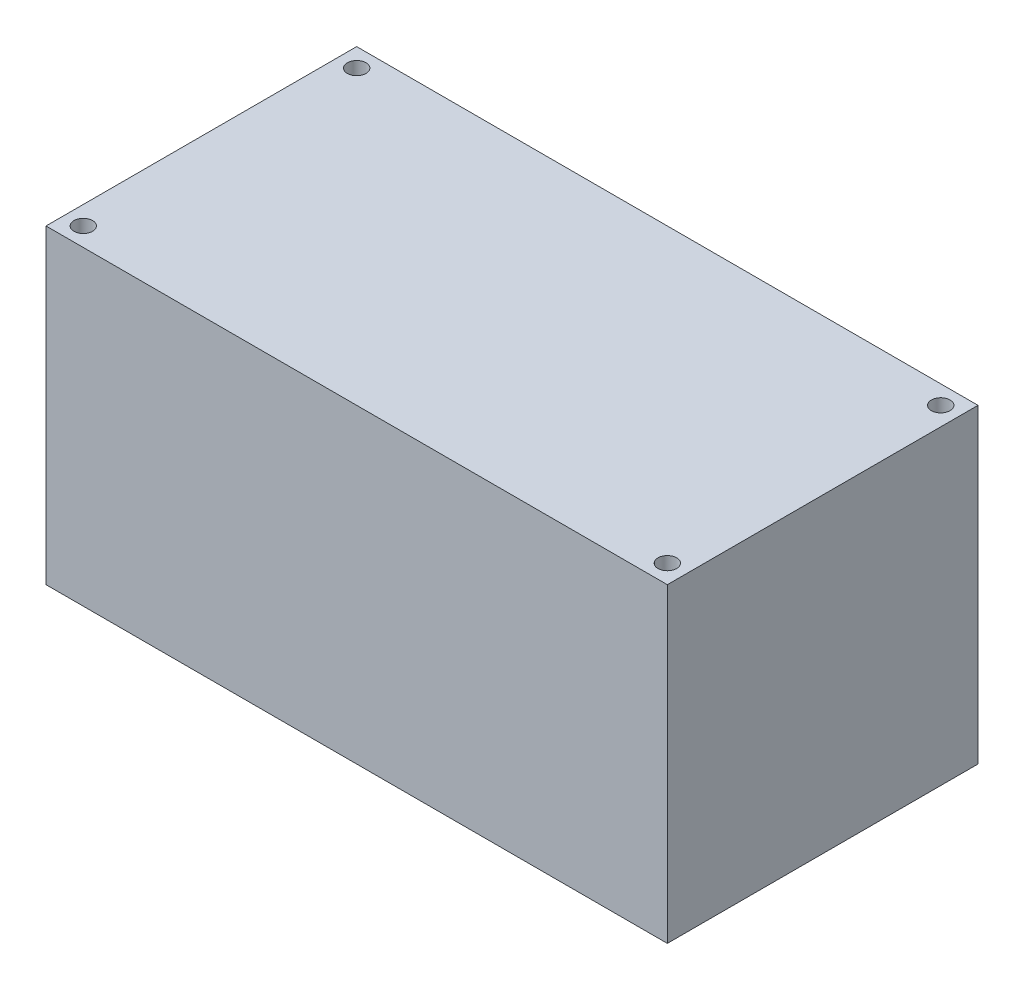
ISO-10303-21;
HEADER;
FILE_DESCRIPTION(('STEP AP214'),'2;1');
FILE_NAME('part.step','',(''),(''),'','','');
FILE_SCHEMA(('AUTOMOTIVE_DESIGN { 1 0 10303 214 1 1 1 1 }'));
ENDSEC;
DATA;
#1=APPLICATION_CONTEXT('core data for automotive mechanical design processes');
#2=APPLICATION_PROTOCOL_DEFINITION('international standard','automotive_design',2000,#1);
#3=PRODUCT_CONTEXT('',#1,'mechanical');
#4=PRODUCT('Part','Part','',(#3));
#5=PRODUCT_RELATED_PRODUCT_CATEGORY('part','',(#4));
#6=PRODUCT_DEFINITION_FORMATION('','',#4);
#7=PRODUCT_DEFINITION_CONTEXT('part definition',#1,'design');
#8=PRODUCT_DEFINITION('design','',#6,#7);
#9=PRODUCT_DEFINITION_SHAPE('','',#8);
#10=(LENGTH_UNIT() NAMED_UNIT(*) SI_UNIT(.MILLI.,.METRE.));
#11=(NAMED_UNIT(*) PLANE_ANGLE_UNIT() SI_UNIT($,.RADIAN.));
#12=(NAMED_UNIT(*) SI_UNIT($,.STERADIAN.) SOLID_ANGLE_UNIT());
#13=UNCERTAINTY_MEASURE_WITH_UNIT(LENGTH_MEASURE(1.E-05),#10,'distance_accuracy_value','');
#14=(GEOMETRIC_REPRESENTATION_CONTEXT(3) GLOBAL_UNCERTAINTY_ASSIGNED_CONTEXT((#13)) GLOBAL_UNIT_ASSIGNED_CONTEXT((#10,
#11,#12)) REPRESENTATION_CONTEXT('',''));
#15=CARTESIAN_POINT('',(0.,0.,0.));
#16=DIRECTION('',(0.,0.,1.));
#17=DIRECTION('',(1.,0.,0.));
#18=AXIS2_PLACEMENT_3D('',#15,#16,#17);
#19=CARTESIAN_POINT('',(-50.,50.,-25.));
#20=DIRECTION('',(1.,0.,0.));
#21=DIRECTION('',(0.,0.,-1.));
#22=AXIS2_PLACEMENT_3D('',#19,#20,#21);
#23=PLANE('',#22);
#24=DIRECTION('',(0.,0.,1.));
#25=VECTOR('',#24,1.);
#26=CARTESIAN_POINT('',(-50.,0.,-25.));
#27=LINE('',#26,#25);
#28=CARTESIAN_POINT('',(-50.,0.,-25.));
#29=VERTEX_POINT('',#28);
#30=CARTESIAN_POINT('',(-50.,0.,25.));
#31=VERTEX_POINT('',#30);
#32=EDGE_CURVE('E98',#29,#31,#27,.T.);
#33=ORIENTED_EDGE('',*,*,#32,.T.);
#34=DIRECTION('',(0.,-1.,0.));
#35=VECTOR('',#34,1.);
#36=CARTESIAN_POINT('',(-50.,50.,25.));
#37=LINE('',#36,#35);
#38=CARTESIAN_POINT('',(-50.,50.,25.));
#39=VERTEX_POINT('',#38);
#40=EDGE_CURVE('E11',#39,#31,#37,.T.);
#41=ORIENTED_EDGE('',*,*,#40,.F.);
#42=DIRECTION('',(0.,0.,1.));
#43=VECTOR('',#42,1.);
#44=CARTESIAN_POINT('',(-50.,50.,-25.));
#45=LINE('',#44,#43);
#46=CARTESIAN_POINT('',(-50.,50.,-25.));
#47=VERTEX_POINT('',#46);
#48=EDGE_CURVE('E86',#47,#39,#45,.T.);
#49=ORIENTED_EDGE('',*,*,#48,.F.);
#50=DIRECTION('',(0.,-1.,0.));
#51=VECTOR('',#50,1.);
#52=CARTESIAN_POINT('',(-50.,50.,-25.));
#53=LINE('',#52,#51);
#54=EDGE_CURVE('E94',#47,#29,#53,.T.);
#55=ORIENTED_EDGE('',*,*,#54,.T.);
#56=EDGE_LOOP('',(#33,#41,#49,#55));
#57=FACE_BOUND('',#56,.T.);
#58=ADVANCED_FACE('F35',(#57),#23,.F.);
#59=CARTESIAN_POINT('',(-50.,50.,25.));
#60=DIRECTION('',(0.,0.,-1.));
#61=DIRECTION('',(-1.,0.,0.));
#62=AXIS2_PLACEMENT_3D('',#59,#60,#61);
#63=PLANE('',#62);
#64=DIRECTION('',(1.,0.,0.));
#65=VECTOR('',#64,1.);
#66=CARTESIAN_POINT('',(-50.,0.,25.));
#67=LINE('',#66,#65);
#68=CARTESIAN_POINT('',(50.,0.,25.));
#69=VERTEX_POINT('',#68);
#70=EDGE_CURVE('E90',#31,#69,#67,.T.);
#71=ORIENTED_EDGE('',*,*,#70,.T.);
#72=DIRECTION('',(0.,-1.,0.));
#73=VECTOR('',#72,1.);
#74=CARTESIAN_POINT('',(50.,50.,25.));
#75=LINE('',#74,#73);
#76=CARTESIAN_POINT('',(50.,50.,25.));
#77=VERTEX_POINT('',#76);
#78=EDGE_CURVE('E43',#77,#69,#75,.T.);
#79=ORIENTED_EDGE('',*,*,#78,.F.);
#80=DIRECTION('',(1.,0.,0.));
#81=VECTOR('',#80,1.);
#82=CARTESIAN_POINT('',(-50.,50.,25.));
#83=LINE('',#82,#81);
#84=EDGE_CURVE('E81',#39,#77,#83,.T.);
#85=ORIENTED_EDGE('',*,*,#84,.F.);
#86=ORIENTED_EDGE('',*,*,#40,.T.);
#87=EDGE_LOOP('',(#71,#79,#85,#86));
#88=FACE_BOUND('',#87,.T.);
#89=ADVANCED_FACE('F89',(#88),#63,.F.);
#90=CARTESIAN_POINT('',(50.,50.,-25.));
#91=DIRECTION('',(-1.,0.,0.));
#92=DIRECTION('',(0.,0.,1.));
#93=AXIS2_PLACEMENT_3D('',#90,#91,#92);
#94=PLANE('',#93);
#95=DIRECTION('',(0.,0.,-1.));
#96=VECTOR('',#95,1.);
#97=CARTESIAN_POINT('',(50.,0.,-25.));
#98=LINE('',#97,#96);
#99=CARTESIAN_POINT('',(50.,0.,-25.));
#100=VERTEX_POINT('',#99);
#101=EDGE_CURVE('E68',#69,#100,#98,.T.);
#102=ORIENTED_EDGE('',*,*,#101,.T.);
#103=DIRECTION('',(0.,-1.,0.));
#104=VECTOR('',#103,1.);
#105=CARTESIAN_POINT('',(50.,50.,-25.));
#106=LINE('',#105,#104);
#107=CARTESIAN_POINT('',(50.,50.,-25.));
#108=VERTEX_POINT('',#107);
#109=EDGE_CURVE('E91',#108,#100,#106,.T.);
#110=ORIENTED_EDGE('',*,*,#109,.F.);
#111=DIRECTION('',(0.,0.,-1.));
#112=VECTOR('',#111,1.);
#113=CARTESIAN_POINT('',(50.,50.,-25.));
#114=LINE('',#113,#112);
#115=EDGE_CURVE('E84',#77,#108,#114,.T.);
#116=ORIENTED_EDGE('',*,*,#115,.F.);
#117=ORIENTED_EDGE('',*,*,#78,.T.);
#118=EDGE_LOOP('',(#102,#110,#116,#117));
#119=FACE_BOUND('',#118,.T.);
#120=ADVANCED_FACE('F92',(#119),#94,.F.);
#121=CARTESIAN_POINT('',(-50.,50.,-25.));
#122=DIRECTION('',(0.,0.,1.));
#123=DIRECTION('',(1.,0.,0.));
#124=AXIS2_PLACEMENT_3D('',#121,#122,#123);
#125=PLANE('',#124);
#126=DIRECTION('',(-1.,0.,0.));
#127=VECTOR('',#126,1.);
#128=CARTESIAN_POINT('',(-50.,0.,-25.));
#129=LINE('',#128,#127);
#130=EDGE_CURVE('E74',#100,#29,#129,.T.);
#131=ORIENTED_EDGE('',*,*,#130,.T.);
#132=ORIENTED_EDGE('',*,*,#54,.F.);
#133=DIRECTION('',(-1.,0.,0.));
#134=VECTOR('',#133,1.);
#135=CARTESIAN_POINT('',(-50.,50.,-25.));
#136=LINE('',#135,#134);
#137=EDGE_CURVE('E51',#108,#47,#136,.T.);
#138=ORIENTED_EDGE('',*,*,#137,.F.);
#139=ORIENTED_EDGE('',*,*,#109,.T.);
#140=EDGE_LOOP('',(#131,#132,#138,#139));
#141=FACE_BOUND('',#140,.T.);
#142=ADVANCED_FACE('F106',(#141),#125,.F.);
#143=CARTESIAN_POINT('',(0.,50.,0.));
#144=DIRECTION('',(0.,1.,0.));
#145=DIRECTION('',(0.,0.,1.));
#146=AXIS2_PLACEMENT_3D('',#143,#144,#145);
#147=PLANE('',#146);
#148=CARTESIAN_POINT('',(47.,50.,-22.));
#149=DIRECTION('',(0.,1.,0.));
#150=DIRECTION('',(0.,0.,-1.));
#151=AXIS2_PLACEMENT_3D('',#148,#149,#150);
#152=CIRCLE('',#151,1.5);
#153=CARTESIAN_POINT('',(47.,50.,-23.5));
#154=VERTEX_POINT('',#153);
#155=EDGE_CURVE('E130',#154,#154,#152,.T.);
#156=ORIENTED_EDGE('',*,*,#155,.F.);
#157=EDGE_LOOP('',(#156));
#158=FACE_BOUND('',#157,.T.);
#159=CARTESIAN_POINT('',(47.,50.,22.));
#160=DIRECTION('',(0.,1.,0.));
#161=DIRECTION('',(0.,0.,-1.));
#162=AXIS2_PLACEMENT_3D('',#159,#160,#161);
#163=CIRCLE('',#162,1.50000000000002);
#164=CARTESIAN_POINT('',(47.,50.,20.5));
#165=VERTEX_POINT('',#164);
#166=EDGE_CURVE('E124',#165,#165,#163,.T.);
#167=ORIENTED_EDGE('',*,*,#166,.F.);
#168=EDGE_LOOP('',(#167));
#169=FACE_BOUND('',#168,.T.);
#170=CARTESIAN_POINT('',(-47.,50.,22.));
#171=DIRECTION('',(0.,1.,0.));
#172=DIRECTION('',(0.,0.,1.));
#173=AXIS2_PLACEMENT_3D('',#170,#171,#172);
#174=CIRCLE('',#173,1.5);
#175=CARTESIAN_POINT('',(-47.,50.,23.5));
#176=VERTEX_POINT('',#175);
#177=EDGE_CURVE('E118',#176,#176,#174,.T.);
#178=ORIENTED_EDGE('',*,*,#177,.F.);
#179=EDGE_LOOP('',(#178));
#180=FACE_BOUND('',#179,.T.);
#181=CARTESIAN_POINT('',(-47.,50.,-22.));
#182=DIRECTION('',(0.,1.,0.));
#183=DIRECTION('',(0.,0.,1.));
#184=AXIS2_PLACEMENT_3D('',#181,#182,#183);
#185=CIRCLE('',#184,1.5);
#186=CARTESIAN_POINT('',(-47.,50.,-20.5));
#187=VERTEX_POINT('',#186);
#188=EDGE_CURVE('E112',#187,#187,#185,.T.);
#189=ORIENTED_EDGE('',*,*,#188,.F.);
#190=EDGE_LOOP('',(#189));
#191=FACE_BOUND('',#190,.T.);
#192=ORIENTED_EDGE('',*,*,#48,.T.);
#193=ORIENTED_EDGE('',*,*,#84,.T.);
#194=ORIENTED_EDGE('',*,*,#115,.T.);
#195=ORIENTED_EDGE('',*,*,#137,.T.);
#196=EDGE_LOOP('',(#192,#193,#194,#195));
#197=FACE_BOUND('',#196,.T.);
#198=ADVANCED_FACE('F82',(#158,#169,#180,#191,#197),#147,.T.);
#199=CARTESIAN_POINT('',(0.,0.,0.));
#200=DIRECTION('',(0.,1.,0.));
#201=DIRECTION('',(0.,0.,1.));
#202=AXIS2_PLACEMENT_3D('',#199,#200,#201);
#203=PLANE('',#202);
#204=ORIENTED_EDGE('',*,*,#32,.F.);
#205=ORIENTED_EDGE('',*,*,#130,.F.);
#206=ORIENTED_EDGE('',*,*,#101,.F.);
#207=ORIENTED_EDGE('',*,*,#70,.F.);
#208=EDGE_LOOP('',(#204,#205,#206,#207));
#209=FACE_BOUND('',#208,.T.);
#210=ADVANCED_FACE('F109',(#209),#203,.F.);
#211=CARTESIAN_POINT('',(-47.,20.,-22.));
#212=DIRECTION('',(0.,1.,0.));
#213=DIRECTION('',(0.,0.,1.));
#214=AXIS2_PLACEMENT_3D('',#211,#212,#213);
#215=CYLINDRICAL_SURFACE('',#214,1.5);
#216=CARTESIAN_POINT('',(-47.,20.,-22.));
#217=DIRECTION('',(0.,1.,0.));
#218=DIRECTION('',(0.,0.,1.));
#219=AXIS2_PLACEMENT_3D('',#216,#217,#218);
#220=CIRCLE('',#219,1.5);
#221=CARTESIAN_POINT('',(-47.,20.,-20.5));
#222=VERTEX_POINT('',#221);
#223=EDGE_CURVE('E101',#222,#222,#220,.T.);
#224=ORIENTED_EDGE('',*,*,#223,.F.);
#225=EDGE_LOOP('',(#224));
#226=FACE_BOUND('',#225,.T.);
#227=ORIENTED_EDGE('',*,*,#188,.T.);
#228=EDGE_LOOP('',(#227));
#229=FACE_BOUND('',#228,.T.);
#230=ADVANCED_FACE('F154',(#226,#229),#215,.F.);
#231=CARTESIAN_POINT('',(-47.,20.,-22.));
#232=DIRECTION('',(0.,1.,0.));
#233=DIRECTION('',(0.,0.,1.));
#234=AXIS2_PLACEMENT_3D('',#231,#232,#233);
#235=PLANE('',#234);
#236=ORIENTED_EDGE('',*,*,#223,.T.);
#237=EDGE_LOOP('',(#236));
#238=FACE_BOUND('',#237,.T.);
#239=ADVANCED_FACE('F156',(#238),#235,.T.);
#240=CARTESIAN_POINT('',(-47.,20.,22.));
#241=DIRECTION('',(0.,1.,0.));
#242=DIRECTION('',(0.,0.,1.));
#243=AXIS2_PLACEMENT_3D('',#240,#241,#242);
#244=CYLINDRICAL_SURFACE('',#243,1.5);
#245=CARTESIAN_POINT('',(-47.,20.,22.));
#246=DIRECTION('',(0.,1.,0.));
#247=DIRECTION('',(0.,0.,1.));
#248=AXIS2_PLACEMENT_3D('',#245,#246,#247);
#249=CIRCLE('',#248,1.5);
#250=CARTESIAN_POINT('',(-47.,20.,23.5));
#251=VERTEX_POINT('',#250);
#252=EDGE_CURVE('E115',#251,#251,#249,.T.);
#253=ORIENTED_EDGE('',*,*,#252,.F.);
#254=EDGE_LOOP('',(#253));
#255=FACE_BOUND('',#254,.T.);
#256=ORIENTED_EDGE('',*,*,#177,.T.);
#257=EDGE_LOOP('',(#256));
#258=FACE_BOUND('',#257,.T.);
#259=ADVANCED_FACE('F163',(#255,#258),#244,.F.);
#260=CARTESIAN_POINT('',(-47.,20.,22.));
#261=DIRECTION('',(0.,1.,0.));
#262=DIRECTION('',(0.,0.,1.));
#263=AXIS2_PLACEMENT_3D('',#260,#261,#262);
#264=PLANE('',#263);
#265=ORIENTED_EDGE('',*,*,#252,.T.);
#266=EDGE_LOOP('',(#265));
#267=FACE_BOUND('',#266,.T.);
#268=ADVANCED_FACE('F211',(#267),#264,.T.);
#269=CARTESIAN_POINT('',(47.,20.,22.));
#270=DIRECTION('',(0.,1.,0.));
#271=DIRECTION('',(0.,0.,1.));
#272=AXIS2_PLACEMENT_3D('',#269,#270,#271);
#273=CYLINDRICAL_SURFACE('',#272,1.50000000000002);
#274=CARTESIAN_POINT('',(47.,20.,22.));
#275=DIRECTION('',(0.,1.,0.));
#276=DIRECTION('',(0.,0.,-1.));
#277=AXIS2_PLACEMENT_3D('',#274,#275,#276);
#278=CIRCLE('',#277,1.50000000000002);
#279=CARTESIAN_POINT('',(47.,20.,20.5));
#280=VERTEX_POINT('',#279);
#281=EDGE_CURVE('E121',#280,#280,#278,.T.);
#282=ORIENTED_EDGE('',*,*,#281,.F.);
#283=EDGE_LOOP('',(#282));
#284=FACE_BOUND('',#283,.T.);
#285=ORIENTED_EDGE('',*,*,#166,.T.);
#286=EDGE_LOOP('',(#285));
#287=FACE_BOUND('',#286,.T.);
#288=ADVANCED_FACE('F220',(#284,#287),#273,.F.);
#289=CARTESIAN_POINT('',(47.,20.,22.));
#290=DIRECTION('',(0.,-1.,0.));
#291=DIRECTION('',(0.,0.,-1.));
#292=AXIS2_PLACEMENT_3D('',#289,#290,#291);
#293=PLANE('',#292);
#294=ORIENTED_EDGE('',*,*,#281,.T.);
#295=EDGE_LOOP('',(#294));
#296=FACE_BOUND('',#295,.T.);
#297=ADVANCED_FACE('F141',(#296),#293,.F.);
#298=CARTESIAN_POINT('',(47.,20.,-22.));
#299=DIRECTION('',(0.,1.,0.));
#300=DIRECTION('',(0.,0.,1.));
#301=AXIS2_PLACEMENT_3D('',#298,#299,#300);
#302=CYLINDRICAL_SURFACE('',#301,1.5);
#303=CARTESIAN_POINT('',(47.,20.,-22.));
#304=DIRECTION('',(0.,1.,0.));
#305=DIRECTION('',(0.,0.,-1.));
#306=AXIS2_PLACEMENT_3D('',#303,#304,#305);
#307=CIRCLE('',#306,1.5);
#308=CARTESIAN_POINT('',(47.,20.,-23.5));
#309=VERTEX_POINT('',#308);
#310=EDGE_CURVE('E127',#309,#309,#307,.T.);
#311=ORIENTED_EDGE('',*,*,#310,.F.);
#312=EDGE_LOOP('',(#311));
#313=FACE_BOUND('',#312,.T.);
#314=ORIENTED_EDGE('',*,*,#155,.T.);
#315=EDGE_LOOP('',(#314));
#316=FACE_BOUND('',#315,.T.);
#317=ADVANCED_FACE('F138',(#313,#316),#302,.F.);
#318=CARTESIAN_POINT('',(47.,20.,-22.));
#319=DIRECTION('',(0.,-1.,0.));
#320=DIRECTION('',(0.,0.,-1.));
#321=AXIS2_PLACEMENT_3D('',#318,#319,#320);
#322=PLANE('',#321);
#323=ORIENTED_EDGE('',*,*,#310,.T.);
#324=EDGE_LOOP('',(#323));
#325=FACE_BOUND('',#324,.T.);
#326=ADVANCED_FACE('F136',(#325),#322,.F.);
#327=CLOSED_SHELL('',(#58,#89,#120,#142,#198,#210,#230,#239,#259,#268,#288,#297,#317,#326));
#328=MANIFOLD_SOLID_BREP('B2',#327);
#329=ADVANCED_BREP_SHAPE_REPRESENTATION('',(#18,#328),#14);
#330=SHAPE_DEFINITION_REPRESENTATION(#9,#329);
ENDSEC;
END-ISO-10303-21;
